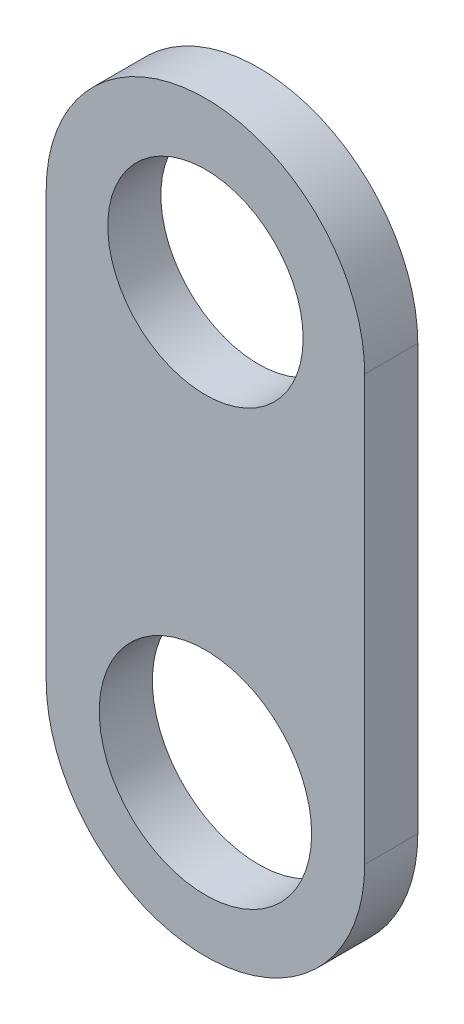
ISO-10303-21;
HEADER;
FILE_DESCRIPTION(('STEP AP214'),'2;1');
FILE_NAME('part.step','',(''),(''),'','','');
FILE_SCHEMA(('AUTOMOTIVE_DESIGN { 1 0 10303 214 1 1 1 1 }'));
ENDSEC;
DATA;
#1=APPLICATION_CONTEXT('core data for automotive mechanical design processes');
#2=APPLICATION_PROTOCOL_DEFINITION('international standard','automotive_design',2000,#1);
#3=PRODUCT_CONTEXT('',#1,'mechanical');
#4=PRODUCT('Part','Part','',(#3));
#5=PRODUCT_RELATED_PRODUCT_CATEGORY('part','',(#4));
#6=PRODUCT_DEFINITION_FORMATION('','',#4);
#7=PRODUCT_DEFINITION_CONTEXT('part definition',#1,'design');
#8=PRODUCT_DEFINITION('design','',#6,#7);
#9=PRODUCT_DEFINITION_SHAPE('','',#8);
#10=(LENGTH_UNIT() NAMED_UNIT(*) SI_UNIT(.MILLI.,.METRE.));
#11=(NAMED_UNIT(*) PLANE_ANGLE_UNIT() SI_UNIT($,.RADIAN.));
#12=(NAMED_UNIT(*) SI_UNIT($,.STERADIAN.) SOLID_ANGLE_UNIT());
#13=UNCERTAINTY_MEASURE_WITH_UNIT(LENGTH_MEASURE(1.E-05),#10,'distance_accuracy_value','');
#14=(GEOMETRIC_REPRESENTATION_CONTEXT(3) GLOBAL_UNCERTAINTY_ASSIGNED_CONTEXT((#13)) GLOBAL_UNIT_ASSIGNED_CONTEXT((#10,
#11,#12)) REPRESENTATION_CONTEXT('',''));
#15=CARTESIAN_POINT('',(0.,0.,0.));
#16=DIRECTION('',(0.,0.,1.));
#17=DIRECTION('',(1.,0.,0.));
#18=AXIS2_PLACEMENT_3D('',#15,#16,#17);
#19=CARTESIAN_POINT('',(19.05,-16.6122809040103,6.35));
#20=DIRECTION('',(0.,0.,-1.));
#21=DIRECTION('',(-1.,0.,0.));
#22=AXIS2_PLACEMENT_3D('',#19,#20,#21);
#23=CYLINDRICAL_SURFACE('',#22,19.05);
#24=CARTESIAN_POINT('',(19.05,-16.6122809040103,0.));
#25=DIRECTION('',(0.,0.,1.));
#26=DIRECTION('',(1.,0.,0.));
#27=AXIS2_PLACEMENT_3D('',#24,#25,#26);
#28=CIRCLE('',#27,19.05);
#29=CARTESIAN_POINT('',(0.,-16.6122809040103,0.));
#30=VERTEX_POINT('',#29);
#31=CARTESIAN_POINT('',(38.1,-16.6122809040103,0.));
#32=VERTEX_POINT('',#31);
#33=EDGE_CURVE('E108',#30,#32,#28,.T.);
#34=ORIENTED_EDGE('',*,*,#33,.T.);
#35=DIRECTION('',(0.,0.,-1.));
#36=VECTOR('',#35,1.);
#37=CARTESIAN_POINT('',(38.1,-16.6122809040103,6.35));
#38=LINE('',#37,#36);
#39=CARTESIAN_POINT('',(38.1,-16.6122809040103,6.35));
#40=VERTEX_POINT('',#39);
#41=EDGE_CURVE('E11',#40,#32,#38,.T.);
#42=ORIENTED_EDGE('',*,*,#41,.F.);
#43=CARTESIAN_POINT('',(19.05,-16.6122809040103,6.35));
#44=DIRECTION('',(0.,0.,1.));
#45=DIRECTION('',(1.,0.,0.));
#46=AXIS2_PLACEMENT_3D('',#43,#44,#45);
#47=CIRCLE('',#46,19.05);
#48=CARTESIAN_POINT('',(0.,-16.6122809040103,6.35));
#49=VERTEX_POINT('',#48);
#50=EDGE_CURVE('E91',#49,#40,#47,.T.);
#51=ORIENTED_EDGE('',*,*,#50,.F.);
#52=DIRECTION('',(0.,0.,-1.));
#53=VECTOR('',#52,1.);
#54=CARTESIAN_POINT('',(0.,-16.6122809040103,6.35));
#55=LINE('',#54,#53);
#56=EDGE_CURVE('E109',#49,#30,#55,.T.);
#57=ORIENTED_EDGE('',*,*,#56,.T.);
#58=EDGE_LOOP('',(#34,#42,#51,#57));
#59=FACE_BOUND('',#58,.T.);
#60=ADVANCED_FACE('F39',(#59),#23,.T.);
#61=CARTESIAN_POINT('',(38.1,0.,6.35));
#62=DIRECTION('',(-1.,0.,0.));
#63=DIRECTION('',(0.,-1.,0.));
#64=AXIS2_PLACEMENT_3D('',#61,#62,#63);
#65=PLANE('',#64);
#66=DIRECTION('',(0.,1.,0.));
#67=VECTOR('',#66,1.);
#68=CARTESIAN_POINT('',(38.1,0.,0.));
#69=LINE('',#68,#67);
#70=CARTESIAN_POINT('',(38.1,34.1877190959897,0.));
#71=VERTEX_POINT('',#70);
#72=EDGE_CURVE('E94',#32,#71,#69,.T.);
#73=ORIENTED_EDGE('',*,*,#72,.T.);
#74=DIRECTION('',(0.,0.,-1.));
#75=VECTOR('',#74,1.);
#76=CARTESIAN_POINT('',(38.1,34.1877190959897,6.35));
#77=LINE('',#76,#75);
#78=CARTESIAN_POINT('',(38.1,34.1877190959897,6.35));
#79=VERTEX_POINT('',#78);
#80=EDGE_CURVE('E50',#79,#71,#77,.T.);
#81=ORIENTED_EDGE('',*,*,#80,.F.);
#82=DIRECTION('',(0.,1.,0.));
#83=VECTOR('',#82,1.);
#84=CARTESIAN_POINT('',(38.1,0.,6.35));
#85=LINE('',#84,#83);
#86=EDGE_CURVE('E82',#40,#79,#85,.T.);
#87=ORIENTED_EDGE('',*,*,#86,.F.);
#88=ORIENTED_EDGE('',*,*,#41,.T.);
#89=EDGE_LOOP('',(#73,#81,#87,#88));
#90=FACE_BOUND('',#89,.T.);
#91=ADVANCED_FACE('F92',(#90),#65,.F.);
#92=CARTESIAN_POINT('',(19.05,34.1877190959897,6.35));
#93=DIRECTION('',(0.,0.,-1.));
#94=DIRECTION('',(-1.,0.,0.));
#95=AXIS2_PLACEMENT_3D('',#92,#93,#94);
#96=CYLINDRICAL_SURFACE('',#95,19.05);
#97=CARTESIAN_POINT('',(19.05,34.1877190959897,0.));
#98=DIRECTION('',(0.,0.,1.));
#99=DIRECTION('',(1.,0.,0.));
#100=AXIS2_PLACEMENT_3D('',#97,#98,#99);
#101=CIRCLE('',#100,19.05);
#102=CARTESIAN_POINT('',(0.,34.1877190959897,0.));
#103=VERTEX_POINT('',#102);
#104=EDGE_CURVE('E72',#71,#103,#101,.T.);
#105=ORIENTED_EDGE('',*,*,#104,.T.);
#106=DIRECTION('',(0.,0.,-1.));
#107=VECTOR('',#106,1.);
#108=CARTESIAN_POINT('',(0.,34.1877190959897,6.35));
#109=LINE('',#108,#107);
#110=CARTESIAN_POINT('',(0.,34.1877190959897,6.35));
#111=VERTEX_POINT('',#110);
#112=EDGE_CURVE('E96',#111,#103,#109,.T.);
#113=ORIENTED_EDGE('',*,*,#112,.F.);
#114=CARTESIAN_POINT('',(19.05,34.1877190959897,6.35));
#115=DIRECTION('',(0.,0.,1.));
#116=DIRECTION('',(1.,0.,0.));
#117=AXIS2_PLACEMENT_3D('',#114,#115,#116);
#118=CIRCLE('',#117,19.05);
#119=EDGE_CURVE('E87',#79,#111,#118,.T.);
#120=ORIENTED_EDGE('',*,*,#119,.F.);
#121=ORIENTED_EDGE('',*,*,#80,.T.);
#122=EDGE_LOOP('',(#105,#113,#120,#121));
#123=FACE_BOUND('',#122,.T.);
#124=ADVANCED_FACE('F100',(#123),#96,.T.);
#125=CARTESIAN_POINT('',(19.05,34.1877190959897,6.35));
#126=DIRECTION('',(0.,0.,-1.));
#127=DIRECTION('',(-1.,0.,0.));
#128=AXIS2_PLACEMENT_3D('',#125,#126,#127);
#129=CYLINDRICAL_SURFACE('',#128,11.684);
#130=CARTESIAN_POINT('',(19.05,34.1877190959897,6.35));
#131=DIRECTION('',(0.,0.,1.));
#132=DIRECTION('',(1.,0.,0.));
#133=AXIS2_PLACEMENT_3D('',#130,#131,#132);
#134=CIRCLE('',#133,11.684);
#135=CARTESIAN_POINT('',(30.734,34.1877190959897,6.35));
#136=VERTEX_POINT('',#135);
#137=EDGE_CURVE('E98',#136,#136,#134,.T.);
#138=ORIENTED_EDGE('',*,*,#137,.T.);
#139=EDGE_LOOP('',(#138));
#140=FACE_BOUND('',#139,.T.);
#141=CARTESIAN_POINT('',(19.05,34.1877190959897,0.));
#142=DIRECTION('',(0.,0.,1.));
#143=DIRECTION('',(1.,0.,0.));
#144=AXIS2_PLACEMENT_3D('',#141,#142,#143);
#145=CIRCLE('',#144,11.684);
#146=CARTESIAN_POINT('',(30.734,34.1877190959897,0.));
#147=VERTEX_POINT('',#146);
#148=EDGE_CURVE('E113',#147,#147,#145,.T.);
#149=ORIENTED_EDGE('',*,*,#148,.F.);
#150=EDGE_LOOP('',(#149));
#151=FACE_BOUND('',#150,.T.);
#152=ADVANCED_FACE('F134',(#140,#151),#129,.F.);
#153=CARTESIAN_POINT('',(0.,0.,6.35));
#154=DIRECTION('',(1.,0.,0.));
#155=DIRECTION('',(0.,1.,0.));
#156=AXIS2_PLACEMENT_3D('',#153,#154,#155);
#157=PLANE('',#156);
#158=DIRECTION('',(0.,-1.,0.));
#159=VECTOR('',#158,1.);
#160=CARTESIAN_POINT('',(0.,0.,0.));
#161=LINE('',#160,#159);
#162=EDGE_CURVE('E76',#103,#30,#161,.T.);
#163=ORIENTED_EDGE('',*,*,#162,.T.);
#164=ORIENTED_EDGE('',*,*,#56,.F.);
#165=DIRECTION('',(0.,-1.,0.));
#166=VECTOR('',#165,1.);
#167=CARTESIAN_POINT('',(0.,0.,6.35));
#168=LINE('',#167,#166);
#169=EDGE_CURVE('E54',#111,#49,#168,.T.);
#170=ORIENTED_EDGE('',*,*,#169,.F.);
#171=ORIENTED_EDGE('',*,*,#112,.T.);
#172=EDGE_LOOP('',(#163,#164,#170,#171));
#173=FACE_BOUND('',#172,.T.);
#174=ADVANCED_FACE('F122',(#173),#157,.F.);
#175=CARTESIAN_POINT('',(19.05,-16.6122809040103,6.35));
#176=DIRECTION('',(0.,0.,-1.));
#177=DIRECTION('',(-1.,0.,0.));
#178=AXIS2_PLACEMENT_3D('',#175,#176,#177);
#179=CYLINDRICAL_SURFACE('',#178,12.7);
#180=CARTESIAN_POINT('',(19.05,-16.6122809040103,6.35));
#181=DIRECTION('',(0.,0.,1.));
#182=DIRECTION('',(1.,0.,0.));
#183=AXIS2_PLACEMENT_3D('',#180,#181,#182);
#184=CIRCLE('',#183,12.7);
#185=CARTESIAN_POINT('',(31.75,-16.6122809040103,6.35));
#186=VERTEX_POINT('',#185);
#187=EDGE_CURVE('E103',#186,#186,#184,.T.);
#188=ORIENTED_EDGE('',*,*,#187,.T.);
#189=EDGE_LOOP('',(#188));
#190=FACE_BOUND('',#189,.T.);
#191=CARTESIAN_POINT('',(19.05,-16.6122809040103,0.));
#192=DIRECTION('',(0.,0.,1.));
#193=DIRECTION('',(1.,0.,0.));
#194=AXIS2_PLACEMENT_3D('',#191,#192,#193);
#195=CIRCLE('',#194,12.7);
#196=CARTESIAN_POINT('',(31.75,-16.6122809040103,0.));
#197=VERTEX_POINT('',#196);
#198=EDGE_CURVE('E119',#197,#197,#195,.T.);
#199=ORIENTED_EDGE('',*,*,#198,.F.);
#200=EDGE_LOOP('',(#199));
#201=FACE_BOUND('',#200,.T.);
#202=ADVANCED_FACE('F139',(#190,#201),#179,.F.);
#203=CARTESIAN_POINT('',(0.,0.,6.35));
#204=DIRECTION('',(0.,0.,1.));
#205=DIRECTION('',(1.,0.,0.));
#206=AXIS2_PLACEMENT_3D('',#203,#204,#205);
#207=PLANE('',#206);
#208=ORIENTED_EDGE('',*,*,#50,.T.);
#209=ORIENTED_EDGE('',*,*,#86,.T.);
#210=ORIENTED_EDGE('',*,*,#119,.T.);
#211=ORIENTED_EDGE('',*,*,#169,.T.);
#212=EDGE_LOOP('',(#208,#209,#210,#211));
#213=FACE_BOUND('',#212,.T.);
#214=ORIENTED_EDGE('',*,*,#137,.F.);
#215=EDGE_LOOP('',(#214));
#216=FACE_BOUND('',#215,.T.);
#217=ORIENTED_EDGE('',*,*,#187,.F.);
#218=EDGE_LOOP('',(#217));
#219=FACE_BOUND('',#218,.T.);
#220=ADVANCED_FACE('F86',(#213,#216,#219),#207,.T.);
#221=CARTESIAN_POINT('',(0.,0.,0.));
#222=DIRECTION('',(0.,0.,1.));
#223=DIRECTION('',(1.,0.,0.));
#224=AXIS2_PLACEMENT_3D('',#221,#222,#223);
#225=PLANE('',#224);
#226=ORIENTED_EDGE('',*,*,#33,.F.);
#227=ORIENTED_EDGE('',*,*,#162,.F.);
#228=ORIENTED_EDGE('',*,*,#104,.F.);
#229=ORIENTED_EDGE('',*,*,#72,.F.);
#230=EDGE_LOOP('',(#226,#227,#228,#229));
#231=FACE_BOUND('',#230,.T.);
#232=ORIENTED_EDGE('',*,*,#148,.T.);
#233=EDGE_LOOP('',(#232));
#234=FACE_BOUND('',#233,.T.);
#235=ORIENTED_EDGE('',*,*,#198,.T.);
#236=EDGE_LOOP('',(#235));
#237=FACE_BOUND('',#236,.T.);
#238=ADVANCED_FACE('F124',(#231,#234,#237),#225,.F.);
#239=CLOSED_SHELL('',(#60,#91,#124,#152,#174,#202,#220,#238));
#240=MANIFOLD_SOLID_BREP('B2',#239);
#241=ADVANCED_BREP_SHAPE_REPRESENTATION('',(#18,#240),#14);
#242=SHAPE_DEFINITION_REPRESENTATION(#9,#241);
ENDSEC;
END-ISO-10303-21;
